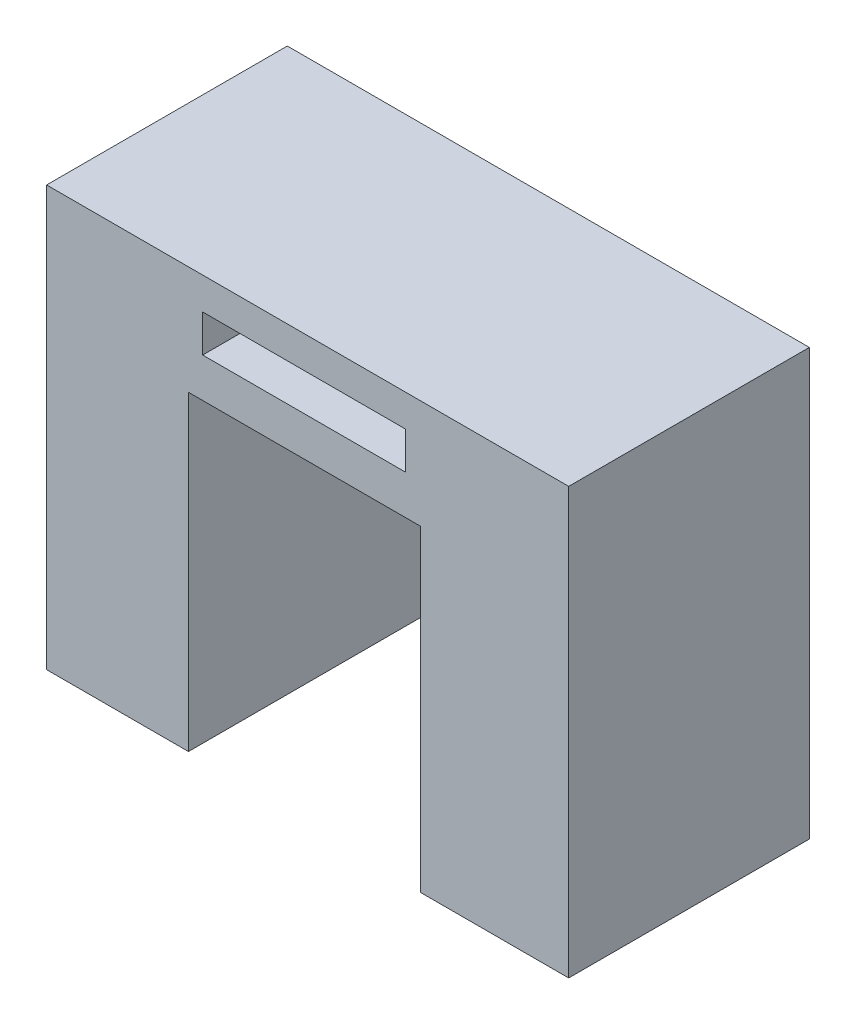
ISO-10303-21;
HEADER;
FILE_DESCRIPTION(('STEP AP214'),'2;1');
FILE_NAME('part.step','',(''),(''),'','','');
FILE_SCHEMA(('AUTOMOTIVE_DESIGN { 1 0 10303 214 1 1 1 1 }'));
ENDSEC;
DATA;
#1=APPLICATION_CONTEXT('core data for automotive mechanical design processes');
#2=APPLICATION_PROTOCOL_DEFINITION('international standard','automotive_design',2000,#1);
#3=PRODUCT_CONTEXT('',#1,'mechanical');
#4=PRODUCT('Part','Part','',(#3));
#5=PRODUCT_RELATED_PRODUCT_CATEGORY('part','',(#4));
#6=PRODUCT_DEFINITION_FORMATION('','',#4);
#7=PRODUCT_DEFINITION_CONTEXT('part definition',#1,'design');
#8=PRODUCT_DEFINITION('design','',#6,#7);
#9=PRODUCT_DEFINITION_SHAPE('','',#8);
#10=(LENGTH_UNIT() NAMED_UNIT(*) SI_UNIT(.MILLI.,.METRE.));
#11=(NAMED_UNIT(*) PLANE_ANGLE_UNIT() SI_UNIT($,.RADIAN.));
#12=(NAMED_UNIT(*) SI_UNIT($,.STERADIAN.) SOLID_ANGLE_UNIT());
#13=UNCERTAINTY_MEASURE_WITH_UNIT(LENGTH_MEASURE(1.E-05),#10,'distance_accuracy_value','');
#14=(GEOMETRIC_REPRESENTATION_CONTEXT(3) GLOBAL_UNCERTAINTY_ASSIGNED_CONTEXT((#13)) GLOBAL_UNIT_ASSIGNED_CONTEXT((#10,
#11,#12)) REPRESENTATION_CONTEXT('',''));
#15=CARTESIAN_POINT('',(0.,0.,0.));
#16=DIRECTION('',(0.,0.,1.));
#17=DIRECTION('',(1.,0.,0.));
#18=AXIS2_PLACEMENT_3D('',#15,#16,#17);
#19=CARTESIAN_POINT('',(0.,92.7931034482759,130.));
#20=DIRECTION('',(0.,-1.,0.));
#21=DIRECTION('',(0.,0.,-1.));
#22=AXIS2_PLACEMENT_3D('',#19,#20,#21);
#23=PLANE('',#22);
#24=DIRECTION('',(-1.,0.,0.));
#25=VECTOR('',#24,1.);
#26=CARTESIAN_POINT('',(0.,92.7931034482759,0.));
#27=LINE('',#26,#25);
#28=CARTESIAN_POINT('',(80.1034482758621,92.7931034482759,0.));
#29=VERTEX_POINT('',#28);
#30=CARTESIAN_POINT('',(-201.906337536999,92.7931034482759,0.));
#31=VERTEX_POINT('',#30);
#32=EDGE_CURVE('E208',#29,#31,#27,.T.);
#33=ORIENTED_EDGE('',*,*,#32,.T.);
#34=DIRECTION('',(0.,0.,-1.));
#35=VECTOR('',#34,1.);
#36=CARTESIAN_POINT('',(-201.906337536999,92.7931034482759,130.));
#37=LINE('',#36,#35);
#38=CARTESIAN_POINT('',(-201.906337536999,92.7931034482759,130.));
#39=VERTEX_POINT('',#38);
#40=EDGE_CURVE('E272',#39,#31,#37,.T.);
#41=ORIENTED_EDGE('',*,*,#40,.F.);
#42=DIRECTION('',(-1.,0.,0.));
#43=VECTOR('',#42,1.);
#44=CARTESIAN_POINT('',(0.,92.7931034482759,130.));
#45=LINE('',#44,#43);
#46=CARTESIAN_POINT('',(80.1034482758621,92.7931034482759,130.));
#47=VERTEX_POINT('',#46);
#48=EDGE_CURVE('E216',#47,#39,#45,.T.);
#49=ORIENTED_EDGE('',*,*,#48,.F.);
#50=DIRECTION('',(0.,0.,-1.));
#51=VECTOR('',#50,1.);
#52=CARTESIAN_POINT('',(80.1034482758621,92.7931034482759,130.));
#53=LINE('',#52,#51);
#54=EDGE_CURVE('E240',#47,#29,#53,.T.);
#55=ORIENTED_EDGE('',*,*,#54,.T.);
#56=EDGE_LOOP('',(#33,#41,#49,#55));
#57=FACE_BOUND('',#56,.T.);
#58=ADVANCED_FACE('F43',(#57),#23,.F.);
#59=CARTESIAN_POINT('',(-201.906337536999,0.,130.));
#60=DIRECTION('',(1.,0.,0.));
#61=DIRECTION('',(0.,0.,-1.));
#62=AXIS2_PLACEMENT_3D('',#59,#60,#61);
#63=PLANE('',#62);
#64=DIRECTION('',(0.,-1.,0.));
#65=VECTOR('',#64,1.);
#66=CARTESIAN_POINT('',(-201.906337536999,0.,0.));
#67=LINE('',#66,#65);
#68=CARTESIAN_POINT('',(-201.906337536999,-133.977222031062,0.));
#69=VERTEX_POINT('',#68);
#70=EDGE_CURVE('E238',#31,#69,#67,.T.);
#71=ORIENTED_EDGE('',*,*,#70,.T.);
#72=DIRECTION('',(0.,0.,-1.));
#73=VECTOR('',#72,1.);
#74=CARTESIAN_POINT('',(-201.906337536999,-133.977222031062,130.));
#75=LINE('',#74,#73);
#76=CARTESIAN_POINT('',(-201.906337536999,-133.977222031062,130.));
#77=VERTEX_POINT('',#76);
#78=EDGE_CURVE('E271',#77,#69,#75,.T.);
#79=ORIENTED_EDGE('',*,*,#78,.F.);
#80=DIRECTION('',(0.,-1.,0.));
#81=VECTOR('',#80,1.);
#82=CARTESIAN_POINT('',(-201.906337536999,0.,130.));
#83=LINE('',#82,#81);
#84=EDGE_CURVE('E218',#39,#77,#83,.T.);
#85=ORIENTED_EDGE('',*,*,#84,.F.);
#86=ORIENTED_EDGE('',*,*,#40,.T.);
#87=EDGE_LOOP('',(#71,#79,#85,#86));
#88=FACE_BOUND('',#87,.T.);
#89=ADVANCED_FACE('F313',(#88),#63,.F.);
#90=CARTESIAN_POINT('',(0.,-133.977222031062,130.));
#91=DIRECTION('',(0.,-1.,0.));
#92=DIRECTION('',(0.,0.,-1.));
#93=AXIS2_PLACEMENT_3D('',#90,#91,#92);
#94=PLANE('',#93);
#95=DIRECTION('',(-1.,0.,0.));
#96=VECTOR('',#95,1.);
#97=CARTESIAN_POINT('',(0.,-133.977222031062,0.));
#98=LINE('',#97,#96);
#99=CARTESIAN_POINT('',(-125.310344827586,-133.977222031062,0.));
#100=VERTEX_POINT('',#99);
#101=EDGE_CURVE('E245',#100,#69,#98,.T.);
#102=ORIENTED_EDGE('',*,*,#101,.F.);
#103=DIRECTION('',(0.,0.,-1.));
#104=VECTOR('',#103,1.);
#105=CARTESIAN_POINT('',(-125.310344827586,-133.977222031062,130.));
#106=LINE('',#105,#104);
#107=CARTESIAN_POINT('',(-125.310344827586,-133.977222031062,130.));
#108=VERTEX_POINT('',#107);
#109=EDGE_CURVE('E267',#108,#100,#106,.T.);
#110=ORIENTED_EDGE('',*,*,#109,.F.);
#111=DIRECTION('',(-1.,0.,0.));
#112=VECTOR('',#111,1.);
#113=CARTESIAN_POINT('',(0.,-133.977222031062,130.));
#114=LINE('',#113,#112);
#115=EDGE_CURVE('E225',#108,#77,#114,.T.);
#116=ORIENTED_EDGE('',*,*,#115,.T.);
#117=ORIENTED_EDGE('',*,*,#78,.T.);
#118=EDGE_LOOP('',(#102,#110,#116,#117));
#119=FACE_BOUND('',#118,.T.);
#120=ADVANCED_FACE('F312',(#119),#94,.T.);
#121=CARTESIAN_POINT('',(-125.310344827586,0.,130.));
#122=DIRECTION('',(1.,0.,0.));
#123=DIRECTION('',(0.,0.,-1.));
#124=AXIS2_PLACEMENT_3D('',#121,#122,#123);
#125=PLANE('',#124);
#126=DIRECTION('',(0.,-1.,0.));
#127=VECTOR('',#126,1.);
#128=CARTESIAN_POINT('',(-125.310344827586,0.,0.));
#129=LINE('',#128,#127);
#130=CARTESIAN_POINT('',(-125.310344827586,34.1034482758621,0.));
#131=VERTEX_POINT('',#130);
#132=EDGE_CURVE('E247',#131,#100,#129,.T.);
#133=ORIENTED_EDGE('',*,*,#132,.F.);
#134=DIRECTION('',(0.,0.,-1.));
#135=VECTOR('',#134,1.);
#136=CARTESIAN_POINT('',(-125.310344827586,34.1034482758621,130.));
#137=LINE('',#136,#135);
#138=CARTESIAN_POINT('',(-125.310344827586,34.1034482758621,130.));
#139=VERTEX_POINT('',#138);
#140=EDGE_CURVE('E270',#139,#131,#137,.T.);
#141=ORIENTED_EDGE('',*,*,#140,.F.);
#142=DIRECTION('',(0.,-1.,0.));
#143=VECTOR('',#142,1.);
#144=CARTESIAN_POINT('',(-125.310344827586,0.,130.));
#145=LINE('',#144,#143);
#146=EDGE_CURVE('E223',#139,#108,#145,.T.);
#147=ORIENTED_EDGE('',*,*,#146,.T.);
#148=ORIENTED_EDGE('',*,*,#109,.T.);
#149=EDGE_LOOP('',(#133,#141,#147,#148));
#150=FACE_BOUND('',#149,.T.);
#151=ADVANCED_FACE('F345',(#150),#125,.T.);
#152=CARTESIAN_POINT('',(0.,34.1034482758621,130.));
#153=DIRECTION('',(0.,1.,0.));
#154=DIRECTION('',(0.,0.,1.));
#155=AXIS2_PLACEMENT_3D('',#152,#153,#154);
#156=PLANE('',#155);
#157=DIRECTION('',(-1.,0.,0.));
#158=VECTOR('',#157,1.);
#159=CARTESIAN_POINT('',(-117.624176621974,34.1034482758621,89.0412214603959));
#160=LINE('',#159,#158);
#161=CARTESIAN_POINT('',(-9.36726534002813,34.1034482758621,89.0412214603959));
#162=VERTEX_POINT('',#161);
#163=CARTESIAN_POINT('',(-117.624176621974,34.1034482758621,89.0412214603959));
#164=VERTEX_POINT('',#163);
#165=EDGE_CURVE('E170',#162,#164,#160,.T.);
#166=ORIENTED_EDGE('',*,*,#165,.F.);
#167=DIRECTION('',(0.,0.,1.));
#168=VECTOR('',#167,1.);
#169=CARTESIAN_POINT('',(-9.36726534002812,34.1034482758621,39.0412214603959));
#170=LINE('',#169,#168);
#171=CARTESIAN_POINT('',(-9.36726534002812,34.1034482758621,39.0412214603959));
#172=VERTEX_POINT('',#171);
#173=EDGE_CURVE('E60',#172,#162,#170,.T.);
#174=ORIENTED_EDGE('',*,*,#173,.F.);
#175=DIRECTION('',(1.,0.,0.));
#176=VECTOR('',#175,1.);
#177=CARTESIAN_POINT('',(-117.624176621974,34.1034482758621,39.0412214603959));
#178=LINE('',#177,#176);
#179=CARTESIAN_POINT('',(-117.624176621974,34.1034482758621,39.0412214603959));
#180=VERTEX_POINT('',#179);
#181=EDGE_CURVE('E171',#180,#172,#178,.T.);
#182=ORIENTED_EDGE('',*,*,#181,.F.);
#183=DIRECTION('',(0.,0.,-1.));
#184=VECTOR('',#183,1.);
#185=CARTESIAN_POINT('',(-117.624176621974,34.1034482758621,39.0412214603959));
#186=LINE('',#185,#184);
#187=EDGE_CURVE('E157',#164,#180,#186,.T.);
#188=ORIENTED_EDGE('',*,*,#187,.F.);
#189=EDGE_LOOP('',(#166,#174,#182,#188));
#190=FACE_BOUND('',#189,.T.);
#191=DIRECTION('',(1.,0.,0.));
#192=VECTOR('',#191,1.);
#193=CARTESIAN_POINT('',(0.,34.1034482758621,0.));
#194=LINE('',#193,#192);
#195=CARTESIAN_POINT('',(0.,34.1034482758621,0.));
#196=VERTEX_POINT('',#195);
#197=EDGE_CURVE('E249',#131,#196,#194,.T.);
#198=ORIENTED_EDGE('',*,*,#197,.T.);
#199=DIRECTION('',(0.,0.,-1.));
#200=VECTOR('',#199,1.);
#201=CARTESIAN_POINT('',(0.,34.1034482758621,130.));
#202=LINE('',#201,#200);
#203=CARTESIAN_POINT('',(0.,34.1034482758621,130.));
#204=VERTEX_POINT('',#203);
#205=EDGE_CURVE('E262',#204,#196,#202,.T.);
#206=ORIENTED_EDGE('',*,*,#205,.F.);
#207=DIRECTION('',(1.,0.,0.));
#208=VECTOR('',#207,1.);
#209=CARTESIAN_POINT('',(0.,34.1034482758621,130.));
#210=LINE('',#209,#208);
#211=EDGE_CURVE('E230',#139,#204,#210,.T.);
#212=ORIENTED_EDGE('',*,*,#211,.F.);
#213=ORIENTED_EDGE('',*,*,#140,.T.);
#214=EDGE_LOOP('',(#198,#206,#212,#213));
#215=FACE_BOUND('',#214,.T.);
#216=ADVANCED_FACE('F172',(#190,#215),#156,.F.);
#217=CARTESIAN_POINT('',(0.,0.,130.));
#218=DIRECTION('',(1.,0.,0.));
#219=DIRECTION('',(0.,0.,-1.));
#220=AXIS2_PLACEMENT_3D('',#217,#218,#219);
#221=PLANE('',#220);
#222=DIRECTION('',(0.,-1.,0.));
#223=VECTOR('',#222,1.);
#224=CARTESIAN_POINT('',(0.,0.,0.));
#225=LINE('',#224,#223);
#226=CARTESIAN_POINT('',(0.,-137.206896551724,0.));
#227=VERTEX_POINT('',#226);
#228=EDGE_CURVE('E253',#196,#227,#225,.T.);
#229=ORIENTED_EDGE('',*,*,#228,.T.);
#230=DIRECTION('',(0.,0.,-1.));
#231=VECTOR('',#230,1.);
#232=CARTESIAN_POINT('',(0.,-137.206896551724,130.));
#233=LINE('',#232,#231);
#234=CARTESIAN_POINT('',(0.,-137.206896551724,130.));
#235=VERTEX_POINT('',#234);
#236=EDGE_CURVE('E261',#235,#227,#233,.T.);
#237=ORIENTED_EDGE('',*,*,#236,.F.);
#238=DIRECTION('',(0.,-1.,0.));
#239=VECTOR('',#238,1.);
#240=CARTESIAN_POINT('',(0.,0.,130.));
#241=LINE('',#240,#239);
#242=EDGE_CURVE('E228',#204,#235,#241,.T.);
#243=ORIENTED_EDGE('',*,*,#242,.F.);
#244=ORIENTED_EDGE('',*,*,#205,.T.);
#245=EDGE_LOOP('',(#229,#237,#243,#244));
#246=FACE_BOUND('',#245,.T.);
#247=ADVANCED_FACE('F337',(#246),#221,.F.);
#248=CARTESIAN_POINT('',(0.,-137.206896551724,130.));
#249=DIRECTION('',(0.,1.,0.));
#250=DIRECTION('',(0.,0.,1.));
#251=AXIS2_PLACEMENT_3D('',#248,#249,#250);
#252=PLANE('',#251);
#253=DIRECTION('',(1.,0.,0.));
#254=VECTOR('',#253,1.);
#255=CARTESIAN_POINT('',(0.,-137.206896551724,0.));
#256=LINE('',#255,#254);
#257=CARTESIAN_POINT('',(80.1034482758621,-137.206896551724,0.));
#258=VERTEX_POINT('',#257);
#259=EDGE_CURVE('E251',#227,#258,#256,.T.);
#260=ORIENTED_EDGE('',*,*,#259,.T.);
#261=DIRECTION('',(0.,0.,-1.));
#262=VECTOR('',#261,1.);
#263=CARTESIAN_POINT('',(80.1034482758621,-137.206896551724,130.));
#264=LINE('',#263,#262);
#265=CARTESIAN_POINT('',(80.1034482758621,-137.206896551724,130.));
#266=VERTEX_POINT('',#265);
#267=EDGE_CURVE('E259',#266,#258,#264,.T.);
#268=ORIENTED_EDGE('',*,*,#267,.F.);
#269=DIRECTION('',(1.,0.,0.));
#270=VECTOR('',#269,1.);
#271=CARTESIAN_POINT('',(0.,-137.206896551724,130.));
#272=LINE('',#271,#270);
#273=EDGE_CURVE('E235',#235,#266,#272,.T.);
#274=ORIENTED_EDGE('',*,*,#273,.F.);
#275=ORIENTED_EDGE('',*,*,#236,.T.);
#276=EDGE_LOOP('',(#260,#268,#274,#275));
#277=FACE_BOUND('',#276,.T.);
#278=ADVANCED_FACE('F329',(#277),#252,.F.);
#279=CARTESIAN_POINT('',(80.1034482758621,0.,130.));
#280=DIRECTION('',(1.,0.,0.));
#281=DIRECTION('',(0.,0.,-1.));
#282=AXIS2_PLACEMENT_3D('',#279,#280,#281);
#283=PLANE('',#282);
#284=DIRECTION('',(0.,-1.,0.));
#285=VECTOR('',#284,1.);
#286=CARTESIAN_POINT('',(80.1034482758621,0.,0.));
#287=LINE('',#286,#285);
#288=EDGE_CURVE('E219',#29,#258,#287,.T.);
#289=ORIENTED_EDGE('',*,*,#288,.F.);
#290=ORIENTED_EDGE('',*,*,#54,.F.);
#291=DIRECTION('',(0.,-1.,0.));
#292=VECTOR('',#291,1.);
#293=CARTESIAN_POINT('',(80.1034482758621,0.,130.));
#294=LINE('',#293,#292);
#295=EDGE_CURVE('E234',#47,#266,#294,.T.);
#296=ORIENTED_EDGE('',*,*,#295,.T.);
#297=ORIENTED_EDGE('',*,*,#267,.T.);
#298=EDGE_LOOP('',(#289,#290,#296,#297));
#299=FACE_BOUND('',#298,.T.);
#300=ADVANCED_FACE('F324',(#299),#283,.T.);
#301=CARTESIAN_POINT('',(0.,0.,130.));
#302=DIRECTION('',(0.,0.,1.));
#303=DIRECTION('',(1.,0.,0.));
#304=AXIS2_PLACEMENT_3D('',#301,#302,#303);
#305=PLANE('',#304);
#306=DIRECTION('',(0.,-1.,0.));
#307=VECTOR('',#306,1.);
#308=CARTESIAN_POINT('',(-117.624176621974,75.5202200117817,130.));
#309=LINE('',#308,#307);
#310=CARTESIAN_POINT('',(-117.624176621974,75.5202200117817,130.));
#311=VERTEX_POINT('',#310);
#312=CARTESIAN_POINT('',(-117.624176621974,55.3597309304991,130.));
#313=VERTEX_POINT('',#312);
#314=EDGE_CURVE('E182',#311,#313,#309,.T.);
#315=ORIENTED_EDGE('',*,*,#314,.F.);
#316=DIRECTION('',(-1.,0.,0.));
#317=VECTOR('',#316,1.);
#318=CARTESIAN_POINT('',(-117.624176621974,75.5202200117817,130.));
#319=LINE('',#318,#317);
#320=CARTESIAN_POINT('',(-7.93744789160566,75.5202200117817,130.));
#321=VERTEX_POINT('',#320);
#322=EDGE_CURVE('E190',#321,#311,#319,.T.);
#323=ORIENTED_EDGE('',*,*,#322,.F.);
#324=DIRECTION('',(0.,1.,0.));
#325=VECTOR('',#324,1.);
#326=CARTESIAN_POINT('',(-7.93744789160566,75.5202200117817,130.));
#327=LINE('',#326,#325);
#328=CARTESIAN_POINT('',(-7.93744789160566,55.3597309304991,130.));
#329=VERTEX_POINT('',#328);
#330=EDGE_CURVE('E203',#329,#321,#327,.T.);
#331=ORIENTED_EDGE('',*,*,#330,.F.);
#332=DIRECTION('',(1.,0.,0.));
#333=VECTOR('',#332,1.);
#334=CARTESIAN_POINT('',(-117.624176621974,55.3597309304991,130.));
#335=LINE('',#334,#333);
#336=EDGE_CURVE('E196',#313,#329,#335,.T.);
#337=ORIENTED_EDGE('',*,*,#336,.F.);
#338=EDGE_LOOP('',(#315,#323,#331,#337));
#339=FACE_BOUND('',#338,.T.);
#340=ORIENTED_EDGE('',*,*,#48,.T.);
#341=ORIENTED_EDGE('',*,*,#84,.T.);
#342=ORIENTED_EDGE('',*,*,#115,.F.);
#343=ORIENTED_EDGE('',*,*,#146,.F.);
#344=ORIENTED_EDGE('',*,*,#211,.T.);
#345=ORIENTED_EDGE('',*,*,#242,.T.);
#346=ORIENTED_EDGE('',*,*,#273,.T.);
#347=ORIENTED_EDGE('',*,*,#295,.F.);
#348=EDGE_LOOP('',(#340,#341,#342,#343,#344,#345,#346,#347));
#349=FACE_BOUND('',#348,.T.);
#350=ADVANCED_FACE('F299',(#339,#349),#305,.T.);
#351=CARTESIAN_POINT('',(0.,0.,0.));
#352=DIRECTION('',(0.,0.,1.));
#353=DIRECTION('',(1.,0.,0.));
#354=AXIS2_PLACEMENT_3D('',#351,#352,#353);
#355=PLANE('',#354);
#356=ORIENTED_EDGE('',*,*,#32,.F.);
#357=ORIENTED_EDGE('',*,*,#288,.T.);
#358=ORIENTED_EDGE('',*,*,#259,.F.);
#359=ORIENTED_EDGE('',*,*,#228,.F.);
#360=ORIENTED_EDGE('',*,*,#197,.F.);
#361=ORIENTED_EDGE('',*,*,#132,.T.);
#362=ORIENTED_EDGE('',*,*,#101,.T.);
#363=ORIENTED_EDGE('',*,*,#70,.F.);
#364=EDGE_LOOP('',(#356,#357,#358,#359,#360,#361,#362,#363));
#365=FACE_BOUND('',#364,.T.);
#366=ADVANCED_FACE('F325',(#365),#355,.F.);
#367=CARTESIAN_POINT('',(-117.624176621974,75.5202200117817,30.));
#368=DIRECTION('',(-1.,0.,0.));
#369=DIRECTION('',(0.,0.,1.));
#370=AXIS2_PLACEMENT_3D('',#367,#368,#369);
#371=PLANE('',#370);
#372=DIRECTION('',(0.,0.,1.));
#373=VECTOR('',#372,1.);
#374=CARTESIAN_POINT('',(-117.624176621974,55.3597309304991,30.));
#375=LINE('',#374,#373);
#376=CARTESIAN_POINT('',(-117.624176621974,55.3597309304991,89.0412214603959));
#377=VERTEX_POINT('',#376);
#378=EDGE_CURVE('E165',#377,#313,#375,.T.);
#379=ORIENTED_EDGE('',*,*,#378,.F.);
#380=DIRECTION('',(0.,-1.,0.));
#381=VECTOR('',#380,1.);
#382=CARTESIAN_POINT('',(-117.624176621974,74.1034482758621,89.0412214603959));
#383=LINE('',#382,#381);
#384=EDGE_CURVE('E63',#377,#164,#383,.T.);
#385=ORIENTED_EDGE('',*,*,#384,.T.);
#386=ORIENTED_EDGE('',*,*,#187,.T.);
#387=DIRECTION('',(0.,-1.,0.));
#388=VECTOR('',#387,1.);
#389=CARTESIAN_POINT('',(-117.624176621974,74.1034482758621,39.0412214603959));
#390=LINE('',#389,#388);
#391=CARTESIAN_POINT('',(-117.624176621974,55.3597309304991,39.0412214603959));
#392=VERTEX_POINT('',#391);
#393=EDGE_CURVE('E162',#392,#180,#390,.T.);
#394=ORIENTED_EDGE('',*,*,#393,.F.);
#395=CARTESIAN_POINT('',(-117.624176621974,55.3597309304991,30.));
#396=VERTEX_POINT('',#395);
#397=EDGE_CURVE('E213',#396,#392,#375,.T.);
#398=ORIENTED_EDGE('',*,*,#397,.F.);
#399=DIRECTION('',(0.,-1.,0.));
#400=VECTOR('',#399,1.);
#401=CARTESIAN_POINT('',(-117.624176621974,75.5202200117817,30.));
#402=LINE('',#401,#400);
#403=CARTESIAN_POINT('',(-117.624176621974,75.5202200117817,30.));
#404=VERTEX_POINT('',#403);
#405=EDGE_CURVE('E184',#404,#396,#402,.T.);
#406=ORIENTED_EDGE('',*,*,#405,.F.);
#407=DIRECTION('',(0.,0.,1.));
#408=VECTOR('',#407,1.);
#409=CARTESIAN_POINT('',(-117.624176621974,75.5202200117817,30.));
#410=LINE('',#409,#408);
#411=EDGE_CURVE('E206',#404,#311,#410,.T.);
#412=ORIENTED_EDGE('',*,*,#411,.T.);
#413=ORIENTED_EDGE('',*,*,#314,.T.);
#414=EDGE_LOOP('',(#379,#385,#386,#394,#398,#406,#412,#413));
#415=FACE_BOUND('',#414,.T.);
#416=ADVANCED_FACE('F156',(#415),#371,.F.);
#417=CARTESIAN_POINT('',(-117.624176621974,75.5202200117817,30.));
#418=DIRECTION('',(0.,1.,0.));
#419=DIRECTION('',(0.,0.,1.));
#420=AXIS2_PLACEMENT_3D('',#417,#418,#419);
#421=PLANE('',#420);
#422=ORIENTED_EDGE('',*,*,#322,.T.);
#423=ORIENTED_EDGE('',*,*,#411,.F.);
#424=DIRECTION('',(-1.,0.,0.));
#425=VECTOR('',#424,1.);
#426=CARTESIAN_POINT('',(-117.624176621974,75.5202200117817,30.));
#427=LINE('',#426,#425);
#428=CARTESIAN_POINT('',(-7.93744789160566,75.5202200117817,30.));
#429=VERTEX_POINT('',#428);
#430=EDGE_CURVE('E194',#429,#404,#427,.T.);
#431=ORIENTED_EDGE('',*,*,#430,.F.);
#432=DIRECTION('',(0.,0.,1.));
#433=VECTOR('',#432,1.);
#434=CARTESIAN_POINT('',(-7.93744789160566,75.5202200117817,30.));
#435=LINE('',#434,#433);
#436=EDGE_CURVE('E207',#429,#321,#435,.T.);
#437=ORIENTED_EDGE('',*,*,#436,.T.);
#438=EDGE_LOOP('',(#422,#423,#431,#437));
#439=FACE_BOUND('',#438,.T.);
#440=ADVANCED_FACE('F294',(#439),#421,.F.);
#441=CARTESIAN_POINT('',(-7.93744789160566,75.5202200117817,30.));
#442=DIRECTION('',(1.,0.,0.));
#443=DIRECTION('',(0.,0.,-1.));
#444=AXIS2_PLACEMENT_3D('',#441,#442,#443);
#445=PLANE('',#444);
#446=ORIENTED_EDGE('',*,*,#330,.T.);
#447=ORIENTED_EDGE('',*,*,#436,.F.);
#448=DIRECTION('',(0.,1.,0.));
#449=VECTOR('',#448,1.);
#450=CARTESIAN_POINT('',(-7.93744789160566,75.5202200117817,30.));
#451=LINE('',#450,#449);
#452=CARTESIAN_POINT('',(-7.93744789160566,55.3597309304991,30.));
#453=VERTEX_POINT('',#452);
#454=EDGE_CURVE('E192',#453,#429,#451,.T.);
#455=ORIENTED_EDGE('',*,*,#454,.F.);
#456=DIRECTION('',(0.,0.,1.));
#457=VECTOR('',#456,1.);
#458=CARTESIAN_POINT('',(-7.93744789160566,55.3597309304991,30.));
#459=LINE('',#458,#457);
#460=EDGE_CURVE('E211',#453,#329,#459,.T.);
#461=ORIENTED_EDGE('',*,*,#460,.T.);
#462=EDGE_LOOP('',(#446,#447,#455,#461));
#463=FACE_BOUND('',#462,.T.);
#464=ADVANCED_FACE('F298',(#463),#445,.F.);
#465=CARTESIAN_POINT('',(-117.624176621974,55.3597309304991,30.));
#466=DIRECTION('',(0.,-1.,0.));
#467=DIRECTION('',(0.,0.,-1.));
#468=AXIS2_PLACEMENT_3D('',#465,#466,#467);
#469=PLANE('',#468);
#470=ORIENTED_EDGE('',*,*,#397,.T.);
#471=DIRECTION('',(1.,0.,0.));
#472=VECTOR('',#471,1.);
#473=CARTESIAN_POINT('',(-117.624176621974,55.3597309304991,39.0412214603959));
#474=LINE('',#473,#472);
#475=CARTESIAN_POINT('',(-9.36726534002812,55.3597309304991,39.0412214603959));
#476=VERTEX_POINT('',#475);
#477=EDGE_CURVE('E11',#392,#476,#474,.T.);
#478=ORIENTED_EDGE('',*,*,#477,.T.);
#479=DIRECTION('',(0.,0.,1.));
#480=VECTOR('',#479,1.);
#481=CARTESIAN_POINT('',(-9.36726534002812,55.3597309304991,30.));
#482=LINE('',#481,#480);
#483=CARTESIAN_POINT('',(-9.36726534002813,55.3597309304991,89.0412214603959));
#484=VERTEX_POINT('',#483);
#485=EDGE_CURVE('E49',#476,#484,#482,.T.);
#486=ORIENTED_EDGE('',*,*,#485,.T.);
#487=DIRECTION('',(-1.,0.,0.));
#488=VECTOR('',#487,1.);
#489=CARTESIAN_POINT('',(-117.624176621974,55.3597309304991,89.0412214603959));
#490=LINE('',#489,#488);
#491=EDGE_CURVE('E277',#484,#377,#490,.T.);
#492=ORIENTED_EDGE('',*,*,#491,.T.);
#493=ORIENTED_EDGE('',*,*,#378,.T.);
#494=ORIENTED_EDGE('',*,*,#336,.T.);
#495=ORIENTED_EDGE('',*,*,#460,.F.);
#496=DIRECTION('',(1.,0.,0.));
#497=VECTOR('',#496,1.);
#498=CARTESIAN_POINT('',(-117.624176621974,55.3597309304991,30.));
#499=LINE('',#498,#497);
#500=EDGE_CURVE('E189',#396,#453,#499,.T.);
#501=ORIENTED_EDGE('',*,*,#500,.F.);
#502=EDGE_LOOP('',(#470,#478,#486,#492,#493,#494,#495,#501));
#503=FACE_BOUND('',#502,.T.);
#504=ADVANCED_FACE('F276',(#503),#469,.F.);
#505=CARTESIAN_POINT('',(0.,0.,30.));
#506=DIRECTION('',(0.,0.,1.));
#507=DIRECTION('',(1.,0.,0.));
#508=AXIS2_PLACEMENT_3D('',#505,#506,#507);
#509=PLANE('',#508);
#510=ORIENTED_EDGE('',*,*,#405,.T.);
#511=ORIENTED_EDGE('',*,*,#500,.T.);
#512=ORIENTED_EDGE('',*,*,#454,.T.);
#513=ORIENTED_EDGE('',*,*,#430,.T.);
#514=EDGE_LOOP('',(#510,#511,#512,#513));
#515=FACE_BOUND('',#514,.T.);
#516=ADVANCED_FACE('F288',(#515),#509,.T.);
#517=CARTESIAN_POINT('',(-9.36726534002812,74.1034482758621,39.0412214603959));
#518=DIRECTION('',(1.,0.,0.));
#519=DIRECTION('',(0.,0.,-1.));
#520=AXIS2_PLACEMENT_3D('',#517,#518,#519);
#521=PLANE('',#520);
#522=DIRECTION('',(0.,-1.,0.));
#523=VECTOR('',#522,1.);
#524=CARTESIAN_POINT('',(-9.36726534002812,74.1034482758621,39.0412214603959));
#525=LINE('',#524,#523);
#526=EDGE_CURVE('E179',#476,#172,#525,.T.);
#527=ORIENTED_EDGE('',*,*,#526,.T.);
#528=ORIENTED_EDGE('',*,*,#173,.T.);
#529=DIRECTION('',(0.,-1.,0.));
#530=VECTOR('',#529,1.);
#531=CARTESIAN_POINT('',(-9.36726534002813,74.1034482758621,89.0412214603959));
#532=LINE('',#531,#530);
#533=EDGE_CURVE('E163',#484,#162,#532,.T.);
#534=ORIENTED_EDGE('',*,*,#533,.F.);
#535=ORIENTED_EDGE('',*,*,#485,.F.);
#536=EDGE_LOOP('',(#527,#528,#534,#535));
#537=FACE_BOUND('',#536,.T.);
#538=ADVANCED_FACE('F282',(#537),#521,.F.);
#539=CARTESIAN_POINT('',(-117.624176621974,74.1034482758621,39.0412214603959));
#540=DIRECTION('',(0.,0.,-1.));
#541=DIRECTION('',(-1.,0.,0.));
#542=AXIS2_PLACEMENT_3D('',#539,#540,#541);
#543=PLANE('',#542);
#544=ORIENTED_EDGE('',*,*,#393,.T.);
#545=ORIENTED_EDGE('',*,*,#181,.T.);
#546=ORIENTED_EDGE('',*,*,#526,.F.);
#547=ORIENTED_EDGE('',*,*,#477,.F.);
#548=EDGE_LOOP('',(#544,#545,#546,#547));
#549=FACE_BOUND('',#548,.T.);
#550=ADVANCED_FACE('F285',(#549),#543,.F.);
#551=CARTESIAN_POINT('',(-117.624176621974,74.1034482758621,89.0412214603959));
#552=DIRECTION('',(0.,0.,1.));
#553=DIRECTION('',(1.,0.,0.));
#554=AXIS2_PLACEMENT_3D('',#551,#552,#553);
#555=PLANE('',#554);
#556=ORIENTED_EDGE('',*,*,#533,.T.);
#557=ORIENTED_EDGE('',*,*,#165,.T.);
#558=ORIENTED_EDGE('',*,*,#384,.F.);
#559=ORIENTED_EDGE('',*,*,#491,.F.);
#560=EDGE_LOOP('',(#556,#557,#558,#559));
#561=FACE_BOUND('',#560,.T.);
#562=ADVANCED_FACE('F169',(#561),#555,.F.);
#563=CLOSED_SHELL('',(#58,#89,#120,#151,#216,#247,#278,#300,#350,#366,#416,#440,#464,#504,#516,
#538,#550,#562));
#564=MANIFOLD_SOLID_BREP('B2',#563);
#565=ADVANCED_BREP_SHAPE_REPRESENTATION('',(#18,#564),#14);
#566=SHAPE_DEFINITION_REPRESENTATION(#9,#565);
ENDSEC;
END-ISO-10303-21;
